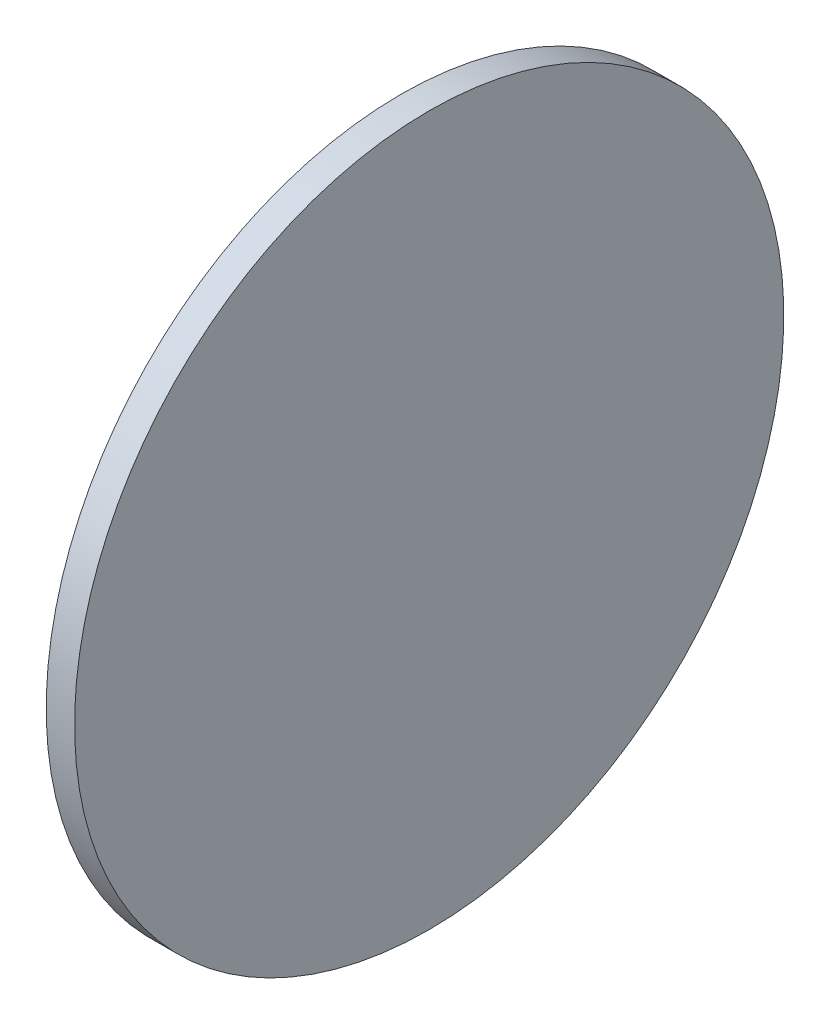
ISO-10303-21;
HEADER;
FILE_DESCRIPTION(('STEP AP214'),'2;1');
FILE_NAME('part.step','',(''),(''),'','','');
FILE_SCHEMA(('AUTOMOTIVE_DESIGN { 1 0 10303 214 1 1 1 1 }'));
ENDSEC;
DATA;
#1=APPLICATION_CONTEXT('core data for automotive mechanical design processes');
#2=APPLICATION_PROTOCOL_DEFINITION('international standard','automotive_design',2000,#1);
#3=PRODUCT_CONTEXT('',#1,'mechanical');
#4=PRODUCT('Part','Part','',(#3));
#5=PRODUCT_RELATED_PRODUCT_CATEGORY('part','',(#4));
#6=PRODUCT_DEFINITION_FORMATION('','',#4);
#7=PRODUCT_DEFINITION_CONTEXT('part definition',#1,'design');
#8=PRODUCT_DEFINITION('design','',#6,#7);
#9=PRODUCT_DEFINITION_SHAPE('','',#8);
#10=(LENGTH_UNIT() NAMED_UNIT(*) SI_UNIT(.MILLI.,.METRE.));
#11=(NAMED_UNIT(*) PLANE_ANGLE_UNIT() SI_UNIT($,.RADIAN.));
#12=(NAMED_UNIT(*) SI_UNIT($,.STERADIAN.) SOLID_ANGLE_UNIT());
#13=UNCERTAINTY_MEASURE_WITH_UNIT(LENGTH_MEASURE(1.E-05),#10,'distance_accuracy_value','');
#14=(GEOMETRIC_REPRESENTATION_CONTEXT(3) GLOBAL_UNCERTAINTY_ASSIGNED_CONTEXT((#13)) GLOBAL_UNIT_ASSIGNED_CONTEXT((#10,
#11,#12)) REPRESENTATION_CONTEXT('',''));
#15=CARTESIAN_POINT('',(0.,0.,0.));
#16=DIRECTION('',(0.,0.,1.));
#17=DIRECTION('',(1.,0.,0.));
#18=AXIS2_PLACEMENT_3D('',#15,#16,#17);
#19=CARTESIAN_POINT('',(0.,0.,0.));
#20=DIRECTION('',(1.,0.,0.));
#21=DIRECTION('',(0.,1.,0.));
#22=AXIS2_PLACEMENT_3D('',#19,#20,#21);
#23=CYLINDRICAL_SURFACE('',#22,27.5);
#24=CARTESIAN_POINT('',(-2.19999999999998,0.,0.));
#25=DIRECTION('',(1.,0.,0.));
#26=DIRECTION('',(0.,1.,0.));
#27=AXIS2_PLACEMENT_3D('',#24,#25,#26);
#28=CIRCLE('',#27,27.5);
#29=CARTESIAN_POINT('',(-2.2,27.5,0.));
#30=VERTEX_POINT('',#29);
#31=EDGE_CURVE('E10',#30,#30,#28,.T.);
#32=ORIENTED_EDGE('',*,*,#31,.T.);
#33=EDGE_LOOP('',(#32));
#34=FACE_BOUND('',#33,.T.);
#35=CARTESIAN_POINT('',(0.,0.,0.));
#36=DIRECTION('',(1.,0.,0.));
#37=DIRECTION('',(0.,1.,0.));
#38=AXIS2_PLACEMENT_3D('',#35,#36,#37);
#39=CIRCLE('',#38,27.5);
#40=CARTESIAN_POINT('',(0.,27.5,0.));
#41=VERTEX_POINT('',#40);
#42=EDGE_CURVE('E54',#41,#41,#39,.T.);
#43=ORIENTED_EDGE('',*,*,#42,.F.);
#44=EDGE_LOOP('',(#43));
#45=FACE_BOUND('',#44,.T.);
#46=ADVANCED_FACE('F47',(#34,#45),#23,.T.);
#47=CARTESIAN_POINT('',(45.9479452054795,0.,0.));
#48=DIRECTION('',(1.,0.,0.));
#49=DIRECTION('',(0.,1.,0.));
#50=AXIS2_PLACEMENT_3D('',#47,#48,#49);
#51=SPHERICAL_SURFACE('',#50,55.4479452054795);
#52=ORIENTED_EDGE('',*,*,#31,.F.);
#53=EDGE_LOOP('',(#52));
#54=FACE_BOUND('',#53,.T.);
#55=ADVANCED_FACE('F64',(#54),#51,.T.);
#56=CARTESIAN_POINT('',(0.,0.,0.));
#57=DIRECTION('',(1.,0.,0.));
#58=DIRECTION('',(0.,1.,0.));
#59=AXIS2_PLACEMENT_3D('',#56,#57,#58);
#60=PLANE('',#59);
#61=ORIENTED_EDGE('',*,*,#42,.T.);
#62=EDGE_LOOP('',(#61));
#63=FACE_BOUND('',#62,.T.);
#64=ADVANCED_FACE('F61',(#63),#60,.T.);
#65=CLOSED_SHELL('',(#46,#55,#64));
#66=MANIFOLD_SOLID_BREP('B2',#65);
#67=ADVANCED_BREP_SHAPE_REPRESENTATION('',(#18,#66),#14);
#68=SHAPE_DEFINITION_REPRESENTATION(#9,#67);
ENDSEC;
END-ISO-10303-21;
